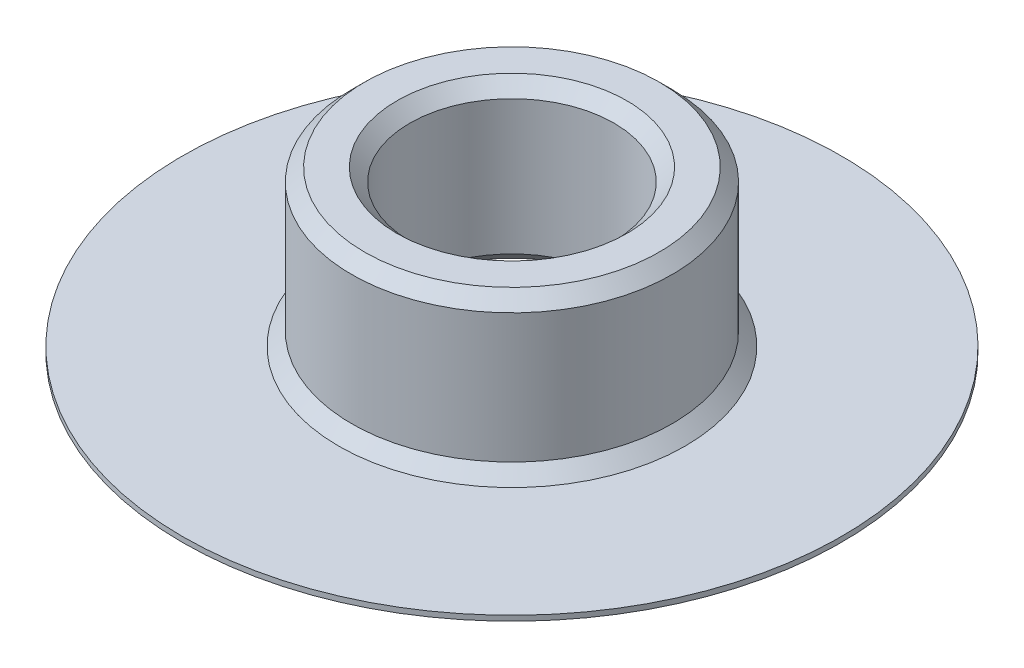
ISO-10303-21;
HEADER;
FILE_DESCRIPTION(('STEP AP214'),'2;1');
FILE_NAME('part.step','',(''),(''),'','','');
FILE_SCHEMA(('AUTOMOTIVE_DESIGN { 1 0 10303 214 1 1 1 1 }'));
ENDSEC;
DATA;
#1=APPLICATION_CONTEXT('core data for automotive mechanical design processes');
#2=APPLICATION_PROTOCOL_DEFINITION('international standard','automotive_design',2000,#1);
#3=PRODUCT_CONTEXT('',#1,'mechanical');
#4=PRODUCT('Part','Part','',(#3));
#5=PRODUCT_RELATED_PRODUCT_CATEGORY('part','',(#4));
#6=PRODUCT_DEFINITION_FORMATION('','',#4);
#7=PRODUCT_DEFINITION_CONTEXT('part definition',#1,'design');
#8=PRODUCT_DEFINITION('design','',#6,#7);
#9=PRODUCT_DEFINITION_SHAPE('','',#8);
#10=(LENGTH_UNIT() NAMED_UNIT(*) SI_UNIT(.MILLI.,.METRE.));
#11=(NAMED_UNIT(*) PLANE_ANGLE_UNIT() SI_UNIT($,.RADIAN.));
#12=(NAMED_UNIT(*) SI_UNIT($,.STERADIAN.) SOLID_ANGLE_UNIT());
#13=UNCERTAINTY_MEASURE_WITH_UNIT(LENGTH_MEASURE(1.E-05),#10,'distance_accuracy_value','');
#14=(GEOMETRIC_REPRESENTATION_CONTEXT(3) GLOBAL_UNCERTAINTY_ASSIGNED_CONTEXT((#13)) GLOBAL_UNIT_ASSIGNED_CONTEXT((#10,
#11,#12)) REPRESENTATION_CONTEXT('',''));
#15=CARTESIAN_POINT('',(0.,0.,0.));
#16=DIRECTION('',(0.,0.,1.));
#17=DIRECTION('',(1.,0.,0.));
#18=AXIS2_PLACEMENT_3D('',#15,#16,#17);
#19=CARTESIAN_POINT('',(0.,0.2,0.));
#20=DIRECTION('',(0.,-1.,0.));
#21=DIRECTION('',(0.,0.,-1.));
#22=AXIS2_PLACEMENT_3D('',#19,#20,#21);
#23=CYLINDRICAL_SURFACE('',#22,12.75);
#24=CARTESIAN_POINT('',(0.,0.2,0.));
#25=DIRECTION('',(0.,1.,0.));
#26=DIRECTION('',(0.,0.,1.));
#27=AXIS2_PLACEMENT_3D('',#24,#25,#26);
#28=CIRCLE('',#27,12.75);
#29=CARTESIAN_POINT('',(0.,0.2,12.75));
#30=VERTEX_POINT('',#29);
#31=EDGE_CURVE('E82',#30,#30,#28,.T.);
#32=ORIENTED_EDGE('',*,*,#31,.F.);
#33=EDGE_LOOP('',(#32));
#34=FACE_BOUND('',#33,.T.);
#35=CARTESIAN_POINT('',(0.,0.,0.));
#36=DIRECTION('',(0.,1.,0.));
#37=DIRECTION('',(0.,0.,1.));
#38=AXIS2_PLACEMENT_3D('',#35,#36,#37);
#39=CIRCLE('',#38,12.75);
#40=CARTESIAN_POINT('',(0.,0.,12.75));
#41=VERTEX_POINT('',#40);
#42=EDGE_CURVE('E83',#41,#41,#39,.T.);
#43=ORIENTED_EDGE('',*,*,#42,.T.);
#44=EDGE_LOOP('',(#43));
#45=FACE_BOUND('',#44,.T.);
#46=ADVANCED_FACE('F41',(#34,#45),#23,.T.);
#47=CARTESIAN_POINT('',(0.,0.2,0.));
#48=DIRECTION('',(0.,1.,0.));
#49=DIRECTION('',(0.,0.,1.));
#50=AXIS2_PLACEMENT_3D('',#47,#48,#49);
#51=PLANE('',#50);
#52=CARTESIAN_POINT('',(0.,0.2,0.));
#53=DIRECTION('',(0.,1.,0.));
#54=DIRECTION('',(0.,0.,1.));
#55=AXIS2_PLACEMENT_3D('',#52,#53,#54);
#56=CIRCLE('',#55,6.70000000000003);
#57=CARTESIAN_POINT('',(0.,0.2,6.70000000000003));
#58=VERTEX_POINT('',#57);
#59=EDGE_CURVE('E11',#58,#58,#56,.F.);
#60=ORIENTED_EDGE('',*,*,#59,.T.);
#61=EDGE_LOOP('',(#60));
#62=FACE_BOUND('',#61,.T.);
#63=ORIENTED_EDGE('',*,*,#31,.T.);
#64=EDGE_LOOP('',(#63));
#65=FACE_BOUND('',#64,.T.);
#66=ADVANCED_FACE('F91',(#62,#65),#51,.T.);
#67=CARTESIAN_POINT('',(0.,0.,0.));
#68=DIRECTION('',(0.,1.,0.));
#69=DIRECTION('',(0.,0.,1.));
#70=AXIS2_PLACEMENT_3D('',#67,#68,#69);
#71=PLANE('',#70);
#72=CARTESIAN_POINT('',(0.,0.,0.));
#73=DIRECTION('',(0.,1.,0.));
#74=DIRECTION('',(0.,0.,1.));
#75=AXIS2_PLACEMENT_3D('',#72,#73,#74);
#76=CIRCLE('',#75,4.44999999999998);
#77=CARTESIAN_POINT('',(0.,0.,4.44999999999998));
#78=VERTEX_POINT('',#77);
#79=EDGE_CURVE('E78',#78,#78,#76,.T.);
#80=ORIENTED_EDGE('',*,*,#79,.T.);
#81=EDGE_LOOP('',(#80));
#82=FACE_BOUND('',#81,.T.);
#83=ORIENTED_EDGE('',*,*,#42,.F.);
#84=EDGE_LOOP('',(#83));
#85=FACE_BOUND('',#84,.T.);
#86=ADVANCED_FACE('F98',(#82,#85),#71,.F.);
#87=CARTESIAN_POINT('',(0.,29.9362481734264,0.));
#88=DIRECTION('',(0.,-1.,0.));
#89=DIRECTION('',(0.,0.,-1.));
#90=AXIS2_PLACEMENT_3D('',#87,#88,#89);
#91=CYLINDRICAL_SURFACE('',#90,6.2);
#92=CARTESIAN_POINT('',(0.,5.70000000000003,0.));
#93=DIRECTION('',(0.,1.,0.));
#94=DIRECTION('',(0.,0.,1.));
#95=AXIS2_PLACEMENT_3D('',#92,#93,#94);
#96=CIRCLE('',#95,6.2);
#97=CARTESIAN_POINT('',(0.,5.70000000000003,-6.2));
#98=VERTEX_POINT('',#97);
#99=EDGE_CURVE('E50',#98,#98,#96,.F.);
#100=CARTESIAN_POINT('',(0.,0.700000000000034,0.));
#101=DIRECTION('',(0.,1.,0.));
#102=DIRECTION('',(0.,0.,1.));
#103=AXIS2_PLACEMENT_3D('',#100,#101,#102);
#104=CIRCLE('',#103,6.2);
#105=CARTESIAN_POINT('',(0.,0.700000000000034,-6.2));
#106=VERTEX_POINT('',#105);
#107=EDGE_CURVE('E55',#106,#106,#104,.T.);
#108=CARTESIAN_POINT('',(0.,5.70000000000003,-6.2));
#109=CARTESIAN_POINT('',(0.,5.6479166666667,-6.2));
#110=CARTESIAN_POINT('',(0.,5.59583333333337,-6.2));
#111=CARTESIAN_POINT('',(0.,5.4916666666667,-6.2));
#112=CARTESIAN_POINT('',(0.,5.43958333333337,-6.2));
#113=CARTESIAN_POINT('',(0.,5.3354166666667,-6.2));
#114=CARTESIAN_POINT('',(0.,5.28333333333336,-6.2));
#115=CARTESIAN_POINT('',(0.,5.1791666666667,-6.2));
#116=CARTESIAN_POINT('',(0.,5.12708333333336,-6.2));
#117=CARTESIAN_POINT('',(0.,5.0229166666667,-6.2));
#118=CARTESIAN_POINT('',(0.,4.97083333333336,-6.2));
#119=CARTESIAN_POINT('',(0.,4.8666666666667,-6.2));
#120=CARTESIAN_POINT('',(0.,4.81458333333336,-6.2));
#121=CARTESIAN_POINT('',(0.,4.7104166666667,-6.2));
#122=CARTESIAN_POINT('',(0.,4.65833333333336,-6.2));
#123=CARTESIAN_POINT('',(0.,4.5541666666667,-6.2));
#124=CARTESIAN_POINT('',(0.,4.50208333333336,-6.2));
#125=CARTESIAN_POINT('',(0.,4.3979166666667,-6.2));
#126=CARTESIAN_POINT('',(0.,4.34583333333337,-6.2));
#127=CARTESIAN_POINT('',(0.,4.2416666666667,-6.2));
#128=CARTESIAN_POINT('',(0.,4.18958333333337,-6.2));
#129=CARTESIAN_POINT('',(0.,4.0854166666667,-6.2));
#130=CARTESIAN_POINT('',(0.,4.03333333333337,-6.2));
#131=CARTESIAN_POINT('',(0.,3.9291666666667,-6.2));
#132=CARTESIAN_POINT('',(0.,3.87708333333337,-6.2));
#133=CARTESIAN_POINT('',(0.,3.7729166666667,-6.2));
#134=CARTESIAN_POINT('',(0.,3.72083333333337,-6.2));
#135=CARTESIAN_POINT('',(0.,3.6166666666667,-6.2));
#136=CARTESIAN_POINT('',(0.,3.56458333333337,-6.2));
#137=CARTESIAN_POINT('',(0.,3.4604166666667,-6.2));
#138=CARTESIAN_POINT('',(0.,3.40833333333337,-6.2));
#139=CARTESIAN_POINT('',(0.,3.3041666666667,-6.2));
#140=CARTESIAN_POINT('',(0.,3.25208333333337,-6.2));
#141=CARTESIAN_POINT('',(0.,3.1479166666667,-6.2));
#142=CARTESIAN_POINT('',(0.,3.09583333333337,-6.2));
#143=CARTESIAN_POINT('',(0.,2.9916666666667,-6.2));
#144=CARTESIAN_POINT('',(0.,2.93958333333337,-6.2));
#145=CARTESIAN_POINT('',(0.,2.8354166666667,-6.2));
#146=CARTESIAN_POINT('',(0.,2.78333333333337,-6.2));
#147=CARTESIAN_POINT('',(0.,2.6791666666667,-6.2));
#148=CARTESIAN_POINT('',(0.,2.62708333333337,-6.2));
#149=CARTESIAN_POINT('',(0.,2.5229166666667,-6.2));
#150=CARTESIAN_POINT('',(0.,2.47083333333337,-6.2));
#151=CARTESIAN_POINT('',(0.,2.3666666666667,-6.2));
#152=CARTESIAN_POINT('',(0.,2.31458333333337,-6.2));
#153=CARTESIAN_POINT('',(0.,2.2104166666667,-6.2));
#154=CARTESIAN_POINT('',(0.,2.15833333333336,-6.2));
#155=CARTESIAN_POINT('',(0.,2.0541666666667,-6.2));
#156=CARTESIAN_POINT('',(0.,2.00208333333337,-6.2));
#157=CARTESIAN_POINT('',(0.,1.8979166666667,-6.2));
#158=CARTESIAN_POINT('',(0.,1.84583333333337,-6.2));
#159=CARTESIAN_POINT('',(0.,1.7416666666667,-6.2));
#160=CARTESIAN_POINT('',(0.,1.68958333333337,-6.2));
#161=CARTESIAN_POINT('',(0.,1.5854166666667,-6.2));
#162=CARTESIAN_POINT('',(0.,1.53333333333337,-6.2));
#163=CARTESIAN_POINT('',(0.,1.4291666666667,-6.2));
#164=CARTESIAN_POINT('',(0.,1.37708333333337,-6.2));
#165=CARTESIAN_POINT('',(0.,1.2729166666667,-6.2));
#166=CARTESIAN_POINT('',(0.,1.22083333333337,-6.2));
#167=CARTESIAN_POINT('',(0.,1.1166666666667,-6.2));
#168=CARTESIAN_POINT('',(0.,1.06458333333337,-6.2));
#169=CARTESIAN_POINT('',(0.,0.960416666666701,-6.2));
#170=CARTESIAN_POINT('',(0.,0.908333333333367,-6.2));
#171=CARTESIAN_POINT('',(0.,0.804166666666701,-6.2));
#172=CARTESIAN_POINT('',(0.,0.752083333333367,-6.2));
#173=CARTESIAN_POINT('',(0.,0.700000000000034,-6.2));
#174=B_SPLINE_CURVE_WITH_KNOTS('',3,(#108,#109,#110,#111,#112,#113,#114,#115,#116,#117,#118,
#119,#120,#121,#122,#123,#124,#125,#126,#127,#128,#129,#130,#131,#132,#133,#134,#135,#136,#137,
#138,#139,#140,#141,#142,#143,#144,#145,#146,#147,#148,#149,#150,#151,#152,#153,#154,#155,#156,
#157,#158,#159,#160,#161,#162,#163,#164,#165,#166,#167,#168,#169,#170,#171,#172,#173),
.UNSPECIFIED.,.F.,.F.,(4,2,2,2,2,2,2,2,2,2,2,2,2,2,2,2,2,2,2,2,2,2,2,2,2,2,2,2,2,2,2,2,4),(0.,
0.15625,0.3125,0.46875,0.625000000000001,0.781250000000001,0.937500000000001,1.09375,1.25,
1.40625,1.5625,1.71875,1.875,2.03125,2.1875,2.34375,2.5,2.65625,2.8125,2.96875,3.125,3.28125,
3.4375,3.59375,3.75,3.90625,4.0625,4.21875,4.375,4.53125,4.6875,4.84375,5.),.UNSPECIFIED.);
#175=EDGE_CURVE('BSEAM100',#98,#106,#174,.T.);
#176=ORIENTED_EDGE('',*,*,#99,.T.);
#177=ORIENTED_EDGE('',*,*,#107,.T.);
#178=ORIENTED_EDGE('',*,*,#175,.T.);
#179=ORIENTED_EDGE('',*,*,#175,.F.);
#180=EDGE_LOOP('',(#176,#178,#177,#179));
#181=FACE_BOUND('',#180,.T.);
#182=ADVANCED_FACE('F100',(#181),#91,.T.);
#183=CARTESIAN_POINT('',(0.,6.2,0.));
#184=DIRECTION('',(0.,1.,0.));
#185=DIRECTION('',(0.,0.,1.));
#186=AXIS2_PLACEMENT_3D('',#183,#184,#185);
#187=PLANE('',#186);
#188=CARTESIAN_POINT('',(0.,6.2,0.));
#189=DIRECTION('',(0.,1.,0.));
#190=DIRECTION('',(0.,0.,1.));
#191=AXIS2_PLACEMENT_3D('',#188,#189,#190);
#192=CIRCLE('',#191,4.45000000000002);
#193=CARTESIAN_POINT('',(0.,6.2,4.45000000000002));
#194=VERTEX_POINT('',#193);
#195=EDGE_CURVE('E60',#194,#194,#192,.F.);
#196=ORIENTED_EDGE('',*,*,#195,.T.);
#197=EDGE_LOOP('',(#196));
#198=FACE_BOUND('',#197,.T.);
#199=CARTESIAN_POINT('',(0.,6.2,0.));
#200=DIRECTION('',(0.,1.,0.));
#201=DIRECTION('',(0.,0.,1.));
#202=AXIS2_PLACEMENT_3D('',#199,#200,#201);
#203=CIRCLE('',#202,5.70000000000003);
#204=CARTESIAN_POINT('',(0.,6.2,5.70000000000003));
#205=VERTEX_POINT('',#204);
#206=EDGE_CURVE('E66',#205,#205,#203,.T.);
#207=ORIENTED_EDGE('',*,*,#206,.T.);
#208=EDGE_LOOP('',(#207));
#209=FACE_BOUND('',#208,.T.);
#210=ADVANCED_FACE('F107',(#198,#209),#187,.T.);
#211=CARTESIAN_POINT('',(0.,0.,0.));
#212=DIRECTION('',(0.,1.,0.));
#213=DIRECTION('',(0.,0.,1.));
#214=AXIS2_PLACEMENT_3D('',#211,#212,#213);
#215=CYLINDRICAL_SURFACE('',#214,3.95);
#216=CARTESIAN_POINT('',(0.,0.499999999999981,0.));
#217=DIRECTION('',(0.,1.,0.));
#218=DIRECTION('',(0.,0.,1.));
#219=AXIS2_PLACEMENT_3D('',#216,#217,#218);
#220=CIRCLE('',#219,3.95);
#221=CARTESIAN_POINT('',(0.,0.49999999999998,3.95));
#222=VERTEX_POINT('',#221);
#223=EDGE_CURVE('E70',#222,#222,#220,.F.);
#224=CARTESIAN_POINT('',(0.,5.69999999999998,0.));
#225=DIRECTION('',(0.,1.,0.));
#226=DIRECTION('',(0.,0.,1.));
#227=AXIS2_PLACEMENT_3D('',#224,#225,#226);
#228=CIRCLE('',#227,3.95);
#229=CARTESIAN_POINT('',(0.,5.69999999999998,3.95));
#230=VERTEX_POINT('',#229);
#231=EDGE_CURVE('E74',#230,#230,#228,.T.);
#232=CARTESIAN_POINT('',(0.,0.49999999999998,3.95));
#233=CARTESIAN_POINT('',(0.,0.554166666666647,3.95));
#234=CARTESIAN_POINT('',(0.,0.608333333333314,3.95));
#235=CARTESIAN_POINT('',(0.,0.716666666666647,3.95));
#236=CARTESIAN_POINT('',(0.,0.770833333333314,3.95));
#237=CARTESIAN_POINT('',(0.,0.879166666666647,3.95));
#238=CARTESIAN_POINT('',(0.,0.933333333333314,3.95));
#239=CARTESIAN_POINT('',(0.,1.04166666666665,3.95));
#240=CARTESIAN_POINT('',(0.,1.09583333333331,3.95));
#241=CARTESIAN_POINT('',(0.,1.20416666666665,3.95));
#242=CARTESIAN_POINT('',(0.,1.25833333333331,3.95));
#243=CARTESIAN_POINT('',(0.,1.36666666666665,3.95));
#244=CARTESIAN_POINT('',(0.,1.42083333333331,3.95));
#245=CARTESIAN_POINT('',(0.,1.52916666666665,3.95));
#246=CARTESIAN_POINT('',(0.,1.58333333333331,3.95));
#247=CARTESIAN_POINT('',(0.,1.69166666666665,3.95));
#248=CARTESIAN_POINT('',(0.,1.74583333333331,3.95));
#249=CARTESIAN_POINT('',(0.,1.85416666666665,3.95));
#250=CARTESIAN_POINT('',(0.,1.90833333333331,3.95));
#251=CARTESIAN_POINT('',(0.,2.01666666666665,3.95));
#252=CARTESIAN_POINT('',(0.,2.07083333333331,3.95));
#253=CARTESIAN_POINT('',(0.,2.17916666666665,3.95));
#254=CARTESIAN_POINT('',(0.,2.23333333333331,3.95));
#255=CARTESIAN_POINT('',(0.,2.34166666666665,3.95));
#256=CARTESIAN_POINT('',(0.,2.39583333333331,3.95));
#257=CARTESIAN_POINT('',(0.,2.50416666666665,3.95));
#258=CARTESIAN_POINT('',(0.,2.55833333333331,3.95));
#259=CARTESIAN_POINT('',(0.,2.66666666666665,3.95));
#260=CARTESIAN_POINT('',(0.,2.72083333333331,3.95));
#261=CARTESIAN_POINT('',(0.,2.82916666666665,3.95));
#262=CARTESIAN_POINT('',(0.,2.88333333333331,3.95));
#263=CARTESIAN_POINT('',(0.,2.99166666666665,3.95));
#264=CARTESIAN_POINT('',(0.,3.04583333333331,3.95));
#265=CARTESIAN_POINT('',(0.,3.15416666666665,3.95));
#266=CARTESIAN_POINT('',(0.,3.20833333333331,3.95));
#267=CARTESIAN_POINT('',(0.,3.31666666666665,3.95));
#268=CARTESIAN_POINT('',(0.,3.37083333333331,3.95));
#269=CARTESIAN_POINT('',(0.,3.47916666666665,3.95));
#270=CARTESIAN_POINT('',(0.,3.53333333333331,3.95));
#271=CARTESIAN_POINT('',(0.,3.64166666666665,3.95));
#272=CARTESIAN_POINT('',(0.,3.69583333333331,3.95));
#273=CARTESIAN_POINT('',(0.,3.80416666666665,3.95));
#274=CARTESIAN_POINT('',(0.,3.85833333333331,3.95));
#275=CARTESIAN_POINT('',(0.,3.96666666666665,3.95));
#276=CARTESIAN_POINT('',(0.,4.02083333333331,3.95));
#277=CARTESIAN_POINT('',(0.,4.12916666666665,3.95));
#278=CARTESIAN_POINT('',(0.,4.18333333333331,3.95));
#279=CARTESIAN_POINT('',(0.,4.29166666666665,3.95));
#280=CARTESIAN_POINT('',(0.,4.34583333333331,3.95));
#281=CARTESIAN_POINT('',(0.,4.45416666666665,3.95));
#282=CARTESIAN_POINT('',(0.,4.50833333333331,3.95));
#283=CARTESIAN_POINT('',(0.,4.61666666666665,3.95));
#284=CARTESIAN_POINT('',(0.,4.67083333333331,3.95));
#285=CARTESIAN_POINT('',(0.,4.77916666666665,3.95));
#286=CARTESIAN_POINT('',(0.,4.83333333333331,3.95));
#287=CARTESIAN_POINT('',(0.,4.94166666666665,3.95));
#288=CARTESIAN_POINT('',(0.,4.99583333333331,3.95));
#289=CARTESIAN_POINT('',(0.,5.10416666666665,3.95));
#290=CARTESIAN_POINT('',(0.,5.15833333333331,3.95));
#291=CARTESIAN_POINT('',(0.,5.26666666666665,3.95));
#292=CARTESIAN_POINT('',(0.,5.32083333333331,3.95));
#293=CARTESIAN_POINT('',(0.,5.42916666666665,3.95));
#294=CARTESIAN_POINT('',(0.,5.48333333333331,3.95));
#295=CARTESIAN_POINT('',(0.,5.59166666666665,3.95));
#296=CARTESIAN_POINT('',(0.,5.64583333333331,3.95));
#297=CARTESIAN_POINT('',(0.,5.69999999999998,3.95));
#298=B_SPLINE_CURVE_WITH_KNOTS('',3,(#232,#233,#234,#235,#236,#237,#238,#239,#240,#241,#242,
#243,#244,#245,#246,#247,#248,#249,#250,#251,#252,#253,#254,#255,#256,#257,#258,#259,#260,#261,
#262,#263,#264,#265,#266,#267,#268,#269,#270,#271,#272,#273,#274,#275,#276,#277,#278,#279,#280,
#281,#282,#283,#284,#285,#286,#287,#288,#289,#290,#291,#292,#293,#294,#295,#296,#297),
.UNSPECIFIED.,.F.,.F.,(4,2,2,2,2,2,2,2,2,2,2,2,2,2,2,2,2,2,2,2,2,2,2,2,2,2,2,2,2,2,2,2,4),(0.,
0.1625,0.325,0.4875,0.65,0.8125,0.975,1.1375,1.3,1.4625,1.625,1.7875,1.95,2.1125,2.275,2.4375,
2.6,2.7625,2.925,3.0875,3.25,3.4125,3.575,3.7375,3.9,4.0625,4.225,4.3875,4.55,4.7125,4.875,
5.0375,5.2),.UNSPECIFIED.);
#299=EDGE_CURVE('BSEAM120',#222,#230,#298,.T.);
#300=ORIENTED_EDGE('',*,*,#223,.T.);
#301=ORIENTED_EDGE('',*,*,#231,.T.);
#302=ORIENTED_EDGE('',*,*,#299,.T.);
#303=ORIENTED_EDGE('',*,*,#299,.F.);
#304=EDGE_LOOP('',(#300,#302,#301,#303));
#305=FACE_BOUND('',#304,.T.);
#306=ADVANCED_FACE('F120',(#305),#215,.F.);
#307=CARTESIAN_POINT('',(0.,0.,0.));
#308=DIRECTION('',(0.,-1.,0.));
#309=DIRECTION('',(0.,0.,-1.));
#310=AXIS2_PLACEMENT_3D('',#307,#308,#309);
#311=CONICAL_SURFACE('',#310,4.44999999999998,0.785398163397445);
#312=ORIENTED_EDGE('',*,*,#223,.F.);
#313=EDGE_LOOP('',(#312));
#314=FACE_BOUND('',#313,.T.);
#315=ORIENTED_EDGE('',*,*,#79,.F.);
#316=EDGE_LOOP('',(#315));
#317=FACE_BOUND('',#316,.T.);
#318=ADVANCED_FACE('F113',(#314,#317),#311,.F.);
#319=CARTESIAN_POINT('',(0.,5.69999999999998,0.));
#320=DIRECTION('',(0.,1.,0.));
#321=DIRECTION('',(0.,0.,1.));
#322=AXIS2_PLACEMENT_3D('',#319,#320,#321);
#323=CONICAL_SURFACE('',#322,3.95,0.785398163397448);
#324=ORIENTED_EDGE('',*,*,#195,.F.);
#325=EDGE_LOOP('',(#324));
#326=FACE_BOUND('',#325,.T.);
#327=ORIENTED_EDGE('',*,*,#231,.F.);
#328=EDGE_LOOP('',(#327));
#329=FACE_BOUND('',#328,.T.);
#330=ADVANCED_FACE('F119',(#326,#329),#323,.F.);
#331=CARTESIAN_POINT('',(0.,6.2,0.));
#332=DIRECTION('',(0.,-1.,0.));
#333=DIRECTION('',(0.,0.,-1.));
#334=AXIS2_PLACEMENT_3D('',#331,#332,#333);
#335=CONICAL_SURFACE('',#334,5.70000000000003,0.785398163397446);
#336=ORIENTED_EDGE('',*,*,#99,.F.);
#337=EDGE_LOOP('',(#336));
#338=FACE_BOUND('',#337,.T.);
#339=ORIENTED_EDGE('',*,*,#206,.F.);
#340=EDGE_LOOP('',(#339));
#341=FACE_BOUND('',#340,.T.);
#342=ADVANCED_FACE('F126',(#338,#341),#335,.T.);
#343=CARTESIAN_POINT('',(0.,0.700000000000034,0.));
#344=DIRECTION('',(0.,-1.,0.));
#345=DIRECTION('',(0.,0.,-1.));
#346=AXIS2_PLACEMENT_3D('',#343,#344,#345);
#347=CONICAL_SURFACE('',#346,6.2,0.785398163397444);
#348=ORIENTED_EDGE('',*,*,#59,.F.);
#349=EDGE_LOOP('',(#348));
#350=FACE_BOUND('',#349,.T.);
#351=ORIENTED_EDGE('',*,*,#107,.F.);
#352=EDGE_LOOP('',(#351));
#353=FACE_BOUND('',#352,.T.);
#354=ADVANCED_FACE('F44',(#350,#353),#347,.T.);
#355=CLOSED_SHELL('',(#46,#66,#86,#182,#210,#306,#318,#330,#342,#354));
#356=MANIFOLD_SOLID_BREP('B2',#355);
#357=ADVANCED_BREP_SHAPE_REPRESENTATION('',(#18,#356),#14);
#358=SHAPE_DEFINITION_REPRESENTATION(#9,#357);
ENDSEC;
END-ISO-10303-21;
